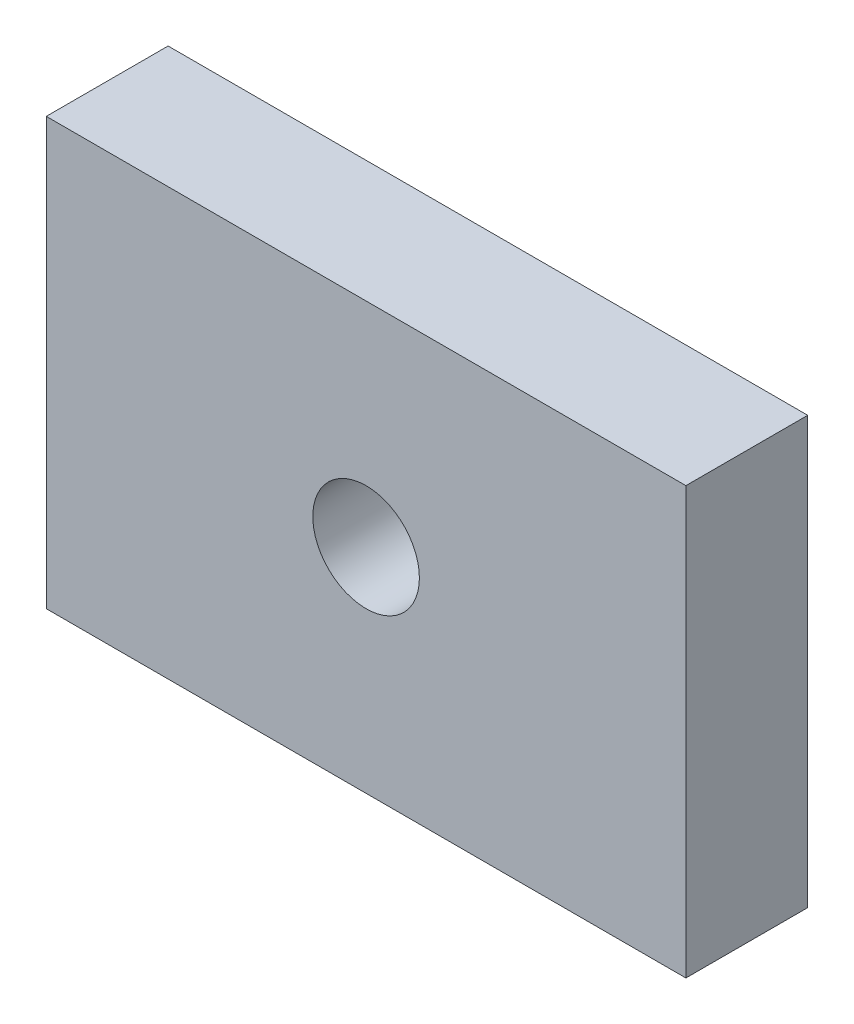
ISO-10303-21;
HEADER;
FILE_DESCRIPTION(('STEP AP214'),'2;1');
FILE_NAME('part.step','',(''),(''),'','','');
FILE_SCHEMA(('AUTOMOTIVE_DESIGN { 1 0 10303 214 1 1 1 1 }'));
ENDSEC;
DATA;
#1=APPLICATION_CONTEXT('core data for automotive mechanical design processes');
#2=APPLICATION_PROTOCOL_DEFINITION('international standard','automotive_design',2000,#1);
#3=PRODUCT_CONTEXT('',#1,'mechanical');
#4=PRODUCT('Part','Part','',(#3));
#5=PRODUCT_RELATED_PRODUCT_CATEGORY('part','',(#4));
#6=PRODUCT_DEFINITION_FORMATION('','',#4);
#7=PRODUCT_DEFINITION_CONTEXT('part definition',#1,'design');
#8=PRODUCT_DEFINITION('design','',#6,#7);
#9=PRODUCT_DEFINITION_SHAPE('','',#8);
#10=(LENGTH_UNIT() NAMED_UNIT(*) SI_UNIT(.MILLI.,.METRE.));
#11=(NAMED_UNIT(*) PLANE_ANGLE_UNIT() SI_UNIT($,.RADIAN.));
#12=(NAMED_UNIT(*) SI_UNIT($,.STERADIAN.) SOLID_ANGLE_UNIT());
#13=UNCERTAINTY_MEASURE_WITH_UNIT(LENGTH_MEASURE(1.E-05),#10,'distance_accuracy_value','');
#14=(GEOMETRIC_REPRESENTATION_CONTEXT(3) GLOBAL_UNCERTAINTY_ASSIGNED_CONTEXT((#13)) GLOBAL_UNIT_ASSIGNED_CONTEXT((#10,
#11,#12)) REPRESENTATION_CONTEXT('',''));
#15=CARTESIAN_POINT('',(0.,0.,0.));
#16=DIRECTION('',(0.,0.,1.));
#17=DIRECTION('',(1.,0.,0.));
#18=AXIS2_PLACEMENT_3D('',#15,#16,#17);
#19=CARTESIAN_POINT('',(0.,0.,8.));
#20=DIRECTION('',(0.,0.,1.));
#21=DIRECTION('',(1.,0.,0.));
#22=AXIS2_PLACEMENT_3D('',#19,#20,#21);
#23=PLANE('',#22);
#24=DIRECTION('',(0.,-1.,0.));
#25=VECTOR('',#24,1.);
#26=CARTESIAN_POINT('',(-20.3531361368496,13.8565573770492,8.));
#27=LINE('',#26,#25);
#28=CARTESIAN_POINT('',(-20.3531361368496,13.8565573770492,8.));
#29=VERTEX_POINT('',#28);
#30=CARTESIAN_POINT('',(-20.3531361368496,-14.1434426229508,8.));
#31=VERTEX_POINT('',#30);
#32=EDGE_CURVE('E121',#29,#31,#27,.T.);
#33=ORIENTED_EDGE('',*,*,#32,.T.);
#34=DIRECTION('',(1.,0.,0.));
#35=VECTOR('',#34,1.);
#36=CARTESIAN_POINT('',(-20.3531361368496,-14.1434426229508,8.));
#37=LINE('',#36,#35);
#38=CARTESIAN_POINT('',(21.6468638631504,-14.1434426229508,8.));
#39=VERTEX_POINT('',#38);
#40=EDGE_CURVE('E86',#31,#39,#37,.T.);
#41=ORIENTED_EDGE('',*,*,#40,.T.);
#42=DIRECTION('',(0.,1.,0.));
#43=VECTOR('',#42,1.);
#44=CARTESIAN_POINT('',(21.6468638631504,13.8565573770492,8.));
#45=LINE('',#44,#43);
#46=CARTESIAN_POINT('',(21.6468638631504,13.8565573770492,8.));
#47=VERTEX_POINT('',#46);
#48=EDGE_CURVE('E124',#39,#47,#45,.T.);
#49=ORIENTED_EDGE('',*,*,#48,.T.);
#50=DIRECTION('',(-1.,0.,0.));
#51=VECTOR('',#50,1.);
#52=CARTESIAN_POINT('',(-20.3531361368496,13.8565573770492,8.));
#53=LINE('',#52,#51);
#54=EDGE_CURVE('E55',#47,#29,#53,.T.);
#55=ORIENTED_EDGE('',*,*,#54,.T.);
#56=EDGE_LOOP('',(#33,#41,#49,#55));
#57=FACE_BOUND('',#56,.T.);
#58=CARTESIAN_POINT('',(0.646863863150385,-0.143442622950825,8.));
#59=DIRECTION('',(0.,0.,1.));
#60=DIRECTION('',(1.,0.,0.));
#61=AXIS2_PLACEMENT_3D('',#58,#59,#60);
#62=CIRCLE('',#61,3.5);
#63=CARTESIAN_POINT('',(4.14686386315038,-0.143442622950825,8.));
#64=VERTEX_POINT('',#63);
#65=EDGE_CURVE('E115',#64,#64,#62,.T.);
#66=ORIENTED_EDGE('',*,*,#65,.F.);
#67=EDGE_LOOP('',(#66));
#68=FACE_BOUND('',#67,.T.);
#69=ADVANCED_FACE('F38',(#57,#68),#23,.T.);
#70=CARTESIAN_POINT('',(0.,0.,0.));
#71=DIRECTION('',(0.,0.,1.));
#72=DIRECTION('',(1.,0.,0.));
#73=AXIS2_PLACEMENT_3D('',#70,#71,#72);
#74=PLANE('',#73);
#75=DIRECTION('',(0.,-1.,0.));
#76=VECTOR('',#75,1.);
#77=CARTESIAN_POINT('',(-20.3531361368496,13.8565573770492,0.));
#78=LINE('',#77,#76);
#79=CARTESIAN_POINT('',(-20.3531361368496,13.8565573770492,0.));
#80=VERTEX_POINT('',#79);
#81=CARTESIAN_POINT('',(-20.3531361368496,-14.1434426229508,0.));
#82=VERTEX_POINT('',#81);
#83=EDGE_CURVE('E118',#80,#82,#78,.T.);
#84=ORIENTED_EDGE('',*,*,#83,.F.);
#85=DIRECTION('',(-1.,0.,0.));
#86=VECTOR('',#85,1.);
#87=CARTESIAN_POINT('',(-20.3531361368496,13.8565573770492,0.));
#88=LINE('',#87,#86);
#89=CARTESIAN_POINT('',(21.6468638631504,13.8565573770492,0.));
#90=VERTEX_POINT('',#89);
#91=EDGE_CURVE('E79',#90,#80,#88,.T.);
#92=ORIENTED_EDGE('',*,*,#91,.F.);
#93=DIRECTION('',(0.,1.,0.));
#94=VECTOR('',#93,1.);
#95=CARTESIAN_POINT('',(21.6468638631504,13.8565573770492,0.));
#96=LINE('',#95,#94);
#97=CARTESIAN_POINT('',(21.6468638631504,-14.1434426229508,0.));
#98=VERTEX_POINT('',#97);
#99=EDGE_CURVE('E73',#98,#90,#96,.T.);
#100=ORIENTED_EDGE('',*,*,#99,.F.);
#101=DIRECTION('',(1.,0.,0.));
#102=VECTOR('',#101,1.);
#103=CARTESIAN_POINT('',(-20.3531361368496,-14.1434426229508,0.));
#104=LINE('',#103,#102);
#105=EDGE_CURVE('E130',#82,#98,#104,.T.);
#106=ORIENTED_EDGE('',*,*,#105,.F.);
#107=EDGE_LOOP('',(#84,#92,#100,#106));
#108=FACE_BOUND('',#107,.T.);
#109=CARTESIAN_POINT('',(0.646863863150385,-0.143442622950825,0.));
#110=DIRECTION('',(0.,0.,1.));
#111=DIRECTION('',(1.,0.,0.));
#112=AXIS2_PLACEMENT_3D('',#109,#110,#111);
#113=CIRCLE('',#112,3.5);
#114=CARTESIAN_POINT('',(4.14686386315038,-0.143442622950825,0.));
#115=VERTEX_POINT('',#114);
#116=EDGE_CURVE('E114',#115,#115,#113,.T.);
#117=ORIENTED_EDGE('',*,*,#116,.T.);
#118=EDGE_LOOP('',(#117));
#119=FACE_BOUND('',#118,.T.);
#120=ADVANCED_FACE('F140',(#108,#119),#74,.F.);
#121=CARTESIAN_POINT('',(-20.3531361368496,13.8565573770492,8.));
#122=DIRECTION('',(1.,0.,0.));
#123=DIRECTION('',(0.,1.,0.));
#124=AXIS2_PLACEMENT_3D('',#121,#122,#123);
#125=PLANE('',#124);
#126=CARTESIAN_POINT('',(-20.3531361368496,-6.14344262295083,4.));
#127=DIRECTION('',(-1.,0.,0.));
#128=DIRECTION('',(0.,0.,1.));
#129=AXIS2_PLACEMENT_3D('',#126,#127,#128);
#130=CIRCLE('',#129,1.64999999999999);
#131=CARTESIAN_POINT('',(-20.3531361368496,-6.14344262295083,5.64999999999999));
#132=VERTEX_POINT('',#131);
#133=EDGE_CURVE('E104',#132,#132,#130,.T.);
#134=ORIENTED_EDGE('',*,*,#133,.F.);
#135=EDGE_LOOP('',(#134));
#136=FACE_BOUND('',#135,.T.);
#137=CARTESIAN_POINT('',(-20.3531361368496,5.85655737704917,4.));
#138=DIRECTION('',(-1.,0.,0.));
#139=DIRECTION('',(0.,0.,1.));
#140=AXIS2_PLACEMENT_3D('',#137,#138,#139);
#141=CIRCLE('',#140,1.64999999999999);
#142=CARTESIAN_POINT('',(-20.3531361368496,5.85655737704917,5.64999999999999));
#143=VERTEX_POINT('',#142);
#144=EDGE_CURVE('E103',#143,#143,#141,.T.);
#145=ORIENTED_EDGE('',*,*,#144,.F.);
#146=EDGE_LOOP('',(#145));
#147=FACE_BOUND('',#146,.T.);
#148=ORIENTED_EDGE('',*,*,#83,.T.);
#149=DIRECTION('',(0.,0.,-1.));
#150=VECTOR('',#149,1.);
#151=CARTESIAN_POINT('',(-20.3531361368496,-14.1434426229508,8.));
#152=LINE('',#151,#150);
#153=EDGE_CURVE('E11',#31,#82,#152,.T.);
#154=ORIENTED_EDGE('',*,*,#153,.F.);
#155=ORIENTED_EDGE('',*,*,#32,.F.);
#156=DIRECTION('',(0.,0.,-1.));
#157=VECTOR('',#156,1.);
#158=CARTESIAN_POINT('',(-20.3531361368496,13.8565573770492,8.));
#159=LINE('',#158,#157);
#160=EDGE_CURVE('E127',#29,#80,#159,.T.);
#161=ORIENTED_EDGE('',*,*,#160,.T.);
#162=EDGE_LOOP('',(#148,#154,#155,#161));
#163=FACE_BOUND('',#162,.T.);
#164=ADVANCED_FACE('F40',(#136,#147,#163),#125,.F.);
#165=CARTESIAN_POINT('',(-20.3531361368496,-14.1434426229508,8.));
#166=DIRECTION('',(0.,1.,0.));
#167=DIRECTION('',(0.,0.,1.));
#168=AXIS2_PLACEMENT_3D('',#165,#166,#167);
#169=PLANE('',#168);
#170=ORIENTED_EDGE('',*,*,#105,.T.);
#171=DIRECTION('',(0.,0.,-1.));
#172=VECTOR('',#171,1.);
#173=CARTESIAN_POINT('',(21.6468638631504,-14.1434426229508,8.));
#174=LINE('',#173,#172);
#175=EDGE_CURVE('E47',#39,#98,#174,.T.);
#176=ORIENTED_EDGE('',*,*,#175,.F.);
#177=ORIENTED_EDGE('',*,*,#40,.F.);
#178=ORIENTED_EDGE('',*,*,#153,.T.);
#179=EDGE_LOOP('',(#170,#176,#177,#178));
#180=FACE_BOUND('',#179,.T.);
#181=ADVANCED_FACE('F156',(#180),#169,.F.);
#182=CARTESIAN_POINT('',(21.6468638631504,13.8565573770492,8.));
#183=DIRECTION('',(-1.,0.,0.));
#184=DIRECTION('',(0.,-1.,0.));
#185=AXIS2_PLACEMENT_3D('',#182,#183,#184);
#186=PLANE('',#185);
#187=ORIENTED_EDGE('',*,*,#99,.T.);
#188=DIRECTION('',(0.,0.,-1.));
#189=VECTOR('',#188,1.);
#190=CARTESIAN_POINT('',(21.6468638631504,13.8565573770492,8.));
#191=LINE('',#190,#189);
#192=EDGE_CURVE('E135',#47,#90,#191,.T.);
#193=ORIENTED_EDGE('',*,*,#192,.F.);
#194=ORIENTED_EDGE('',*,*,#48,.F.);
#195=ORIENTED_EDGE('',*,*,#175,.T.);
#196=EDGE_LOOP('',(#187,#193,#194,#195));
#197=FACE_BOUND('',#196,.T.);
#198=ADVANCED_FACE('F137',(#197),#186,.F.);
#199=CARTESIAN_POINT('',(-20.3531361368496,13.8565573770492,8.));
#200=DIRECTION('',(0.,-1.,0.));
#201=DIRECTION('',(0.,0.,-1.));
#202=AXIS2_PLACEMENT_3D('',#199,#200,#201);
#203=PLANE('',#202);
#204=ORIENTED_EDGE('',*,*,#91,.T.);
#205=ORIENTED_EDGE('',*,*,#160,.F.);
#206=ORIENTED_EDGE('',*,*,#54,.F.);
#207=ORIENTED_EDGE('',*,*,#192,.T.);
#208=EDGE_LOOP('',(#204,#205,#206,#207));
#209=FACE_BOUND('',#208,.T.);
#210=ADVANCED_FACE('F145',(#209),#203,.F.);
#211=CARTESIAN_POINT('',(0.646863863150385,-0.143442622950825,8.));
#212=DIRECTION('',(0.,0.,-1.));
#213=DIRECTION('',(-1.,0.,0.));
#214=AXIS2_PLACEMENT_3D('',#211,#212,#213);
#215=CYLINDRICAL_SURFACE('',#214,3.5);
#216=ORIENTED_EDGE('',*,*,#65,.T.);
#217=EDGE_LOOP('',(#216));
#218=FACE_BOUND('',#217,.T.);
#219=ORIENTED_EDGE('',*,*,#116,.F.);
#220=EDGE_LOOP('',(#219));
#221=FACE_BOUND('',#220,.T.);
#222=ADVANCED_FACE('F147',(#218,#221),#215,.F.);
#223=CARTESIAN_POINT('',(-5.35313613684962,5.85655737704917,4.));
#224=DIRECTION('',(-1.,0.,0.));
#225=DIRECTION('',(0.,0.,1.));
#226=AXIS2_PLACEMENT_3D('',#223,#224,#225);
#227=CONICAL_SURFACE('',#226,1.65,1.02974425867665);
#228=CARTESIAN_POINT('',(-4.36171611545414,5.85655737704917,4.));
#229=VERTEX_POINT('',#228);
#230=VERTEX_LOOP('',#229);
#231=FACE_BOUND('',#230,.T.);
#232=CARTESIAN_POINT('',(-5.35313613684962,5.85655737704917,4.));
#233=DIRECTION('',(-1.,0.,0.));
#234=DIRECTION('',(0.,0.,1.));
#235=AXIS2_PLACEMENT_3D('',#232,#233,#234);
#236=CIRCLE('',#235,1.65);
#237=CARTESIAN_POINT('',(-5.35313613684962,5.85655737704917,5.65));
#238=VERTEX_POINT('',#237);
#239=EDGE_CURVE('E107',#238,#238,#236,.T.);
#240=ORIENTED_EDGE('',*,*,#239,.T.);
#241=EDGE_LOOP('',(#240));
#242=FACE_BOUND('',#241,.T.);
#243=ADVANCED_FACE('F153',(#231,#242),#227,.F.);
#244=CARTESIAN_POINT('',(-20.3531361368496,5.85655737704917,4.));
#245=DIRECTION('',(-1.,0.,0.));
#246=DIRECTION('',(0.,0.,1.));
#247=AXIS2_PLACEMENT_3D('',#244,#245,#246);
#248=CYLINDRICAL_SURFACE('',#247,1.64999999999999);
#249=ORIENTED_EDGE('',*,*,#239,.F.);
#250=EDGE_LOOP('',(#249));
#251=FACE_BOUND('',#250,.T.);
#252=ORIENTED_EDGE('',*,*,#144,.T.);
#253=EDGE_LOOP('',(#252));
#254=FACE_BOUND('',#253,.T.);
#255=ADVANCED_FACE('F97',(#251,#254),#248,.F.);
#256=CARTESIAN_POINT('',(-5.35313613684962,-6.14344262295083,4.));
#257=DIRECTION('',(-1.,0.,0.));
#258=DIRECTION('',(0.,0.,1.));
#259=AXIS2_PLACEMENT_3D('',#256,#257,#258);
#260=CONICAL_SURFACE('',#259,1.65,1.02974425867665);
#261=CARTESIAN_POINT('',(-4.36171611545414,-6.14344262295083,4.));
#262=VERTEX_POINT('',#261);
#263=VERTEX_LOOP('',#262);
#264=FACE_BOUND('',#263,.T.);
#265=CARTESIAN_POINT('',(-5.35313613684962,-6.14344262295083,4.));
#266=DIRECTION('',(-1.,0.,0.));
#267=DIRECTION('',(0.,0.,1.));
#268=AXIS2_PLACEMENT_3D('',#265,#266,#267);
#269=CIRCLE('',#268,1.65);
#270=CARTESIAN_POINT('',(-5.35313613684962,-6.14344262295083,5.65));
#271=VERTEX_POINT('',#270);
#272=EDGE_CURVE('E101',#271,#271,#269,.T.);
#273=ORIENTED_EDGE('',*,*,#272,.T.);
#274=EDGE_LOOP('',(#273));
#275=FACE_BOUND('',#274,.T.);
#276=ADVANCED_FACE('F93',(#264,#275),#260,.F.);
#277=CARTESIAN_POINT('',(-20.3531361368496,-6.14344262295083,4.));
#278=DIRECTION('',(-1.,0.,0.));
#279=DIRECTION('',(0.,0.,1.));
#280=AXIS2_PLACEMENT_3D('',#277,#278,#279);
#281=CYLINDRICAL_SURFACE('',#280,1.64999999999999);
#282=ORIENTED_EDGE('',*,*,#272,.F.);
#283=EDGE_LOOP('',(#282));
#284=FACE_BOUND('',#283,.T.);
#285=ORIENTED_EDGE('',*,*,#133,.T.);
#286=EDGE_LOOP('',(#285));
#287=FACE_BOUND('',#286,.T.);
#288=ADVANCED_FACE('F96',(#284,#287),#281,.F.);
#289=CLOSED_SHELL('',(#69,#120,#164,#181,#198,#210,#222,#243,#255,#276,#288));
#290=MANIFOLD_SOLID_BREP('B2',#289);
#291=ADVANCED_BREP_SHAPE_REPRESENTATION('',(#18,#290),#14);
#292=SHAPE_DEFINITION_REPRESENTATION(#9,#291);
ENDSEC;
END-ISO-10303-21;
